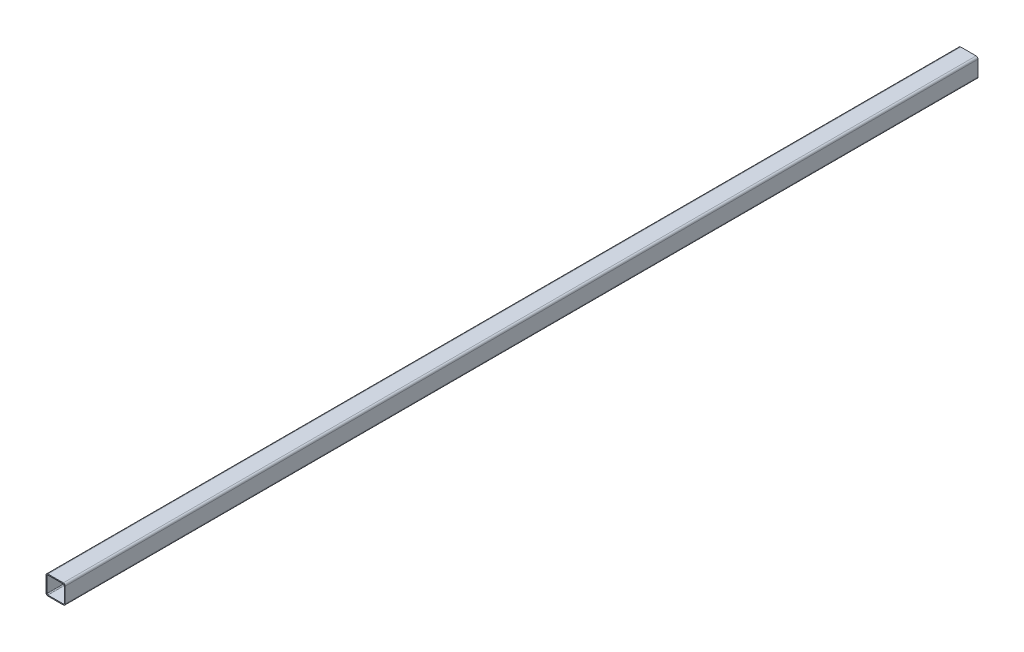
ISO-10303-21;
HEADER;
FILE_DESCRIPTION(('STEP AP214'),'2;1');
FILE_NAME('part.step','',(''),(''),'','','');
FILE_SCHEMA(('AUTOMOTIVE_DESIGN { 1 0 10303 214 1 1 1 1 }'));
ENDSEC;
DATA;
#1=APPLICATION_CONTEXT('core data for automotive mechanical design processes');
#2=APPLICATION_PROTOCOL_DEFINITION('international standard','automotive_design',2000,#1);
#3=PRODUCT_CONTEXT('',#1,'mechanical');
#4=PRODUCT('Part','Part','',(#3));
#5=PRODUCT_RELATED_PRODUCT_CATEGORY('part','',(#4));
#6=PRODUCT_DEFINITION_FORMATION('','',#4);
#7=PRODUCT_DEFINITION_CONTEXT('part definition',#1,'design');
#8=PRODUCT_DEFINITION('design','',#6,#7);
#9=PRODUCT_DEFINITION_SHAPE('','',#8);
#10=(LENGTH_UNIT() NAMED_UNIT(*) SI_UNIT(.MILLI.,.METRE.));
#11=(NAMED_UNIT(*) PLANE_ANGLE_UNIT() SI_UNIT($,.RADIAN.));
#12=(NAMED_UNIT(*) SI_UNIT($,.STERADIAN.) SOLID_ANGLE_UNIT());
#13=UNCERTAINTY_MEASURE_WITH_UNIT(LENGTH_MEASURE(1.E-05),#10,'distance_accuracy_value','');
#14=(GEOMETRIC_REPRESENTATION_CONTEXT(3) GLOBAL_UNCERTAINTY_ASSIGNED_CONTEXT((#13)) GLOBAL_UNIT_ASSIGNED_CONTEXT((#10,
#11,#12)) REPRESENTATION_CONTEXT('',''));
#15=CARTESIAN_POINT('',(0.,0.,0.));
#16=DIRECTION('',(0.,0.,1.));
#17=DIRECTION('',(1.,0.,0.));
#18=AXIS2_PLACEMENT_3D('',#15,#16,#17);
#19=CARTESIAN_POINT('',(16.,-16.,1900.));
#20=DIRECTION('',(0.,0.,-1.));
#21=DIRECTION('',(-1.,0.,0.));
#22=AXIS2_PLACEMENT_3D('',#19,#20,#21);
#23=PLANE('',#22);
#24=CARTESIAN_POINT('',(16.,-16.,1900.));
#25=DIRECTION('',(0.,0.,1.));
#26=DIRECTION('',(-1.,0.,0.));
#27=AXIS2_PLACEMENT_3D('',#24,#25,#26);
#28=CIRCLE('',#27,4.);
#29=CARTESIAN_POINT('',(16.,-20.,1900.));
#30=VERTEX_POINT('',#29);
#31=CARTESIAN_POINT('',(20.,-16.,1900.));
#32=VERTEX_POINT('',#31);
#33=EDGE_CURVE('E212',#30,#32,#28,.T.);
#34=ORIENTED_EDGE('',*,*,#33,.T.);
#35=DIRECTION('',(0.,1.,0.));
#36=VECTOR('',#35,1.);
#37=CARTESIAN_POINT('',(20.,16.,1900.));
#38=LINE('',#37,#36);
#39=CARTESIAN_POINT('',(20.,16.,1900.));
#40=VERTEX_POINT('',#39);
#41=EDGE_CURVE('E215',#32,#40,#38,.T.);
#42=ORIENTED_EDGE('',*,*,#41,.T.);
#43=CARTESIAN_POINT('',(16.,16.,1900.));
#44=DIRECTION('',(0.,0.,1.));
#45=DIRECTION('',(-1.,0.,0.));
#46=AXIS2_PLACEMENT_3D('',#43,#44,#45);
#47=CIRCLE('',#46,4.);
#48=CARTESIAN_POINT('',(16.,20.,1900.));
#49=VERTEX_POINT('',#48);
#50=EDGE_CURVE('E218',#40,#49,#47,.T.);
#51=ORIENTED_EDGE('',*,*,#50,.T.);
#52=DIRECTION('',(-1.,0.,0.));
#53=VECTOR('',#52,1.);
#54=CARTESIAN_POINT('',(-16.,20.,1900.));
#55=LINE('',#54,#53);
#56=CARTESIAN_POINT('',(-16.,20.,1900.));
#57=VERTEX_POINT('',#56);
#58=EDGE_CURVE('E220',#49,#57,#55,.T.);
#59=ORIENTED_EDGE('',*,*,#58,.T.);
#60=CARTESIAN_POINT('',(-16.,16.,1900.));
#61=DIRECTION('',(0.,0.,1.));
#62=DIRECTION('',(1.,0.,0.));
#63=AXIS2_PLACEMENT_3D('',#60,#61,#62);
#64=CIRCLE('',#63,4.);
#65=CARTESIAN_POINT('',(-20.,16.,1900.));
#66=VERTEX_POINT('',#65);
#67=EDGE_CURVE('E222',#57,#66,#64,.T.);
#68=ORIENTED_EDGE('',*,*,#67,.T.);
#69=DIRECTION('',(0.,-1.,0.));
#70=VECTOR('',#69,1.);
#71=CARTESIAN_POINT('',(-20.,16.,1900.));
#72=LINE('',#71,#70);
#73=CARTESIAN_POINT('',(-20.,-16.,1900.));
#74=VERTEX_POINT('',#73);
#75=EDGE_CURVE('E224',#66,#74,#72,.T.);
#76=ORIENTED_EDGE('',*,*,#75,.T.);
#77=CARTESIAN_POINT('',(-16.,-16.,1900.));
#78=DIRECTION('',(0.,0.,1.));
#79=DIRECTION('',(1.,0.,0.));
#80=AXIS2_PLACEMENT_3D('',#77,#78,#79);
#81=CIRCLE('',#80,4.);
#82=CARTESIAN_POINT('',(-16.,-20.,1900.));
#83=VERTEX_POINT('',#82);
#84=EDGE_CURVE('E226',#74,#83,#81,.T.);
#85=ORIENTED_EDGE('',*,*,#84,.T.);
#86=DIRECTION('',(1.,0.,0.));
#87=VECTOR('',#86,1.);
#88=CARTESIAN_POINT('',(-16.,-20.,1900.));
#89=LINE('',#88,#87);
#90=EDGE_CURVE('E228',#83,#30,#89,.T.);
#91=ORIENTED_EDGE('',*,*,#90,.T.);
#92=EDGE_LOOP('',(#34,#42,#51,#59,#68,#76,#85,#91));
#93=FACE_BOUND('',#92,.T.);
#94=CARTESIAN_POINT('',(-16.,16.,1900.));
#95=DIRECTION('',(0.,0.,1.));
#96=DIRECTION('',(1.,0.,0.));
#97=AXIS2_PLACEMENT_3D('',#94,#95,#96);
#98=CIRCLE('',#97,2.);
#99=CARTESIAN_POINT('',(-16.,18.,1900.));
#100=VERTEX_POINT('',#99);
#101=CARTESIAN_POINT('',(-18.,16.,1900.));
#102=VERTEX_POINT('',#101);
#103=EDGE_CURVE('E147',#100,#102,#98,.T.);
#104=ORIENTED_EDGE('',*,*,#103,.F.);
#105=DIRECTION('',(-1.,0.,0.));
#106=VECTOR('',#105,1.);
#107=CARTESIAN_POINT('',(-16.,18.,1900.));
#108=LINE('',#107,#106);
#109=CARTESIAN_POINT('',(16.,18.,1900.));
#110=VERTEX_POINT('',#109);
#111=EDGE_CURVE('E180',#110,#100,#108,.T.);
#112=ORIENTED_EDGE('',*,*,#111,.F.);
#113=CARTESIAN_POINT('',(16.,16.,1900.));
#114=DIRECTION('',(0.,0.,1.));
#115=DIRECTION('',(-1.,0.,0.));
#116=AXIS2_PLACEMENT_3D('',#113,#114,#115);
#117=CIRCLE('',#116,2.);
#118=CARTESIAN_POINT('',(18.,16.,1900.));
#119=VERTEX_POINT('',#118);
#120=EDGE_CURVE('E178',#119,#110,#117,.T.);
#121=ORIENTED_EDGE('',*,*,#120,.F.);
#122=DIRECTION('',(0.,1.,0.));
#123=VECTOR('',#122,1.);
#124=CARTESIAN_POINT('',(18.,16.,1900.));
#125=LINE('',#124,#123);
#126=CARTESIAN_POINT('',(18.,-16.,1900.));
#127=VERTEX_POINT('',#126);
#128=EDGE_CURVE('E176',#127,#119,#125,.T.);
#129=ORIENTED_EDGE('',*,*,#128,.F.);
#130=CARTESIAN_POINT('',(16.,-16.,1900.));
#131=DIRECTION('',(0.,0.,1.));
#132=DIRECTION('',(-1.,0.,0.));
#133=AXIS2_PLACEMENT_3D('',#130,#131,#132);
#134=CIRCLE('',#133,2.);
#135=CARTESIAN_POINT('',(16.,-18.,1900.));
#136=VERTEX_POINT('',#135);
#137=EDGE_CURVE('E174',#136,#127,#134,.T.);
#138=ORIENTED_EDGE('',*,*,#137,.F.);
#139=DIRECTION('',(1.,0.,0.));
#140=VECTOR('',#139,1.);
#141=CARTESIAN_POINT('',(-16.,-18.,1900.));
#142=LINE('',#141,#140);
#143=CARTESIAN_POINT('',(-16.,-18.,1900.));
#144=VERTEX_POINT('',#143);
#145=EDGE_CURVE('E170',#144,#136,#142,.T.);
#146=ORIENTED_EDGE('',*,*,#145,.F.);
#147=CARTESIAN_POINT('',(-16.,-16.,1900.));
#148=DIRECTION('',(0.,0.,1.));
#149=DIRECTION('',(1.,0.,0.));
#150=AXIS2_PLACEMENT_3D('',#147,#148,#149);
#151=CIRCLE('',#150,2.);
#152=CARTESIAN_POINT('',(-18.,-16.,1900.));
#153=VERTEX_POINT('',#152);
#154=EDGE_CURVE('E168',#153,#144,#151,.T.);
#155=ORIENTED_EDGE('',*,*,#154,.F.);
#156=DIRECTION('',(0.,-1.,0.));
#157=VECTOR('',#156,1.);
#158=CARTESIAN_POINT('',(-18.,16.,1900.));
#159=LINE('',#158,#157);
#160=EDGE_CURVE('E155',#102,#153,#159,.T.);
#161=ORIENTED_EDGE('',*,*,#160,.F.);
#162=EDGE_LOOP('',(#104,#112,#121,#129,#138,#146,#155,#161));
#163=FACE_BOUND('',#162,.T.);
#164=ADVANCED_FACE('F34',(#93,#163),#23,.F.);
#165=CARTESIAN_POINT('',(16.,-16.,0.));
#166=DIRECTION('',(0.,0.,-1.));
#167=DIRECTION('',(-1.,0.,0.));
#168=AXIS2_PLACEMENT_3D('',#165,#166,#167);
#169=PLANE('',#168);
#170=CARTESIAN_POINT('',(16.,-16.,0.));
#171=DIRECTION('',(0.,0.,1.));
#172=DIRECTION('',(-1.,0.,0.));
#173=AXIS2_PLACEMENT_3D('',#170,#171,#172);
#174=CIRCLE('',#173,4.);
#175=CARTESIAN_POINT('',(16.,-20.,0.));
#176=VERTEX_POINT('',#175);
#177=CARTESIAN_POINT('',(20.,-16.,0.));
#178=VERTEX_POINT('',#177);
#179=EDGE_CURVE('E163',#176,#178,#174,.T.);
#180=ORIENTED_EDGE('',*,*,#179,.F.);
#181=DIRECTION('',(1.,0.,0.));
#182=VECTOR('',#181,1.);
#183=CARTESIAN_POINT('',(-16.,-20.,0.));
#184=LINE('',#183,#182);
#185=CARTESIAN_POINT('',(-16.,-20.,0.));
#186=VERTEX_POINT('',#185);
#187=EDGE_CURVE('E216',#186,#176,#184,.T.);
#188=ORIENTED_EDGE('',*,*,#187,.F.);
#189=CARTESIAN_POINT('',(-16.,-16.,0.));
#190=DIRECTION('',(0.,0.,1.));
#191=DIRECTION('',(1.,0.,0.));
#192=AXIS2_PLACEMENT_3D('',#189,#190,#191);
#193=CIRCLE('',#192,4.);
#194=CARTESIAN_POINT('',(-20.,-16.,0.));
#195=VERTEX_POINT('',#194);
#196=EDGE_CURVE('E243',#195,#186,#193,.T.);
#197=ORIENTED_EDGE('',*,*,#196,.F.);
#198=DIRECTION('',(0.,-1.,0.));
#199=VECTOR('',#198,1.);
#200=CARTESIAN_POINT('',(-20.,16.,0.));
#201=LINE('',#200,#199);
#202=CARTESIAN_POINT('',(-20.,16.,0.));
#203=VERTEX_POINT('',#202);
#204=EDGE_CURVE('E241',#203,#195,#201,.T.);
#205=ORIENTED_EDGE('',*,*,#204,.F.);
#206=CARTESIAN_POINT('',(-16.,16.,0.));
#207=DIRECTION('',(0.,0.,1.));
#208=DIRECTION('',(1.,0.,0.));
#209=AXIS2_PLACEMENT_3D('',#206,#207,#208);
#210=CIRCLE('',#209,4.);
#211=CARTESIAN_POINT('',(-16.,20.,0.));
#212=VERTEX_POINT('',#211);
#213=EDGE_CURVE('E239',#212,#203,#210,.T.);
#214=ORIENTED_EDGE('',*,*,#213,.F.);
#215=DIRECTION('',(-1.,0.,0.));
#216=VECTOR('',#215,1.);
#217=CARTESIAN_POINT('',(-16.,20.,0.));
#218=LINE('',#217,#216);
#219=CARTESIAN_POINT('',(16.,20.,0.));
#220=VERTEX_POINT('',#219);
#221=EDGE_CURVE('E237',#220,#212,#218,.T.);
#222=ORIENTED_EDGE('',*,*,#221,.F.);
#223=CARTESIAN_POINT('',(16.,16.,0.));
#224=DIRECTION('',(0.,0.,1.));
#225=DIRECTION('',(-1.,0.,0.));
#226=AXIS2_PLACEMENT_3D('',#223,#224,#225);
#227=CIRCLE('',#226,4.);
#228=CARTESIAN_POINT('',(20.,16.,0.));
#229=VERTEX_POINT('',#228);
#230=EDGE_CURVE('E235',#229,#220,#227,.T.);
#231=ORIENTED_EDGE('',*,*,#230,.F.);
#232=DIRECTION('',(0.,1.,0.));
#233=VECTOR('',#232,1.);
#234=CARTESIAN_POINT('',(20.,16.,0.));
#235=LINE('',#234,#233);
#236=EDGE_CURVE('E233',#178,#229,#235,.T.);
#237=ORIENTED_EDGE('',*,*,#236,.F.);
#238=EDGE_LOOP('',(#180,#188,#197,#205,#214,#222,#231,#237));
#239=FACE_BOUND('',#238,.T.);
#240=DIRECTION('',(-1.,0.,0.));
#241=VECTOR('',#240,1.);
#242=CARTESIAN_POINT('',(-16.,18.,0.));
#243=LINE('',#242,#241);
#244=CARTESIAN_POINT('',(16.,18.,0.));
#245=VERTEX_POINT('',#244);
#246=CARTESIAN_POINT('',(-16.,18.,0.));
#247=VERTEX_POINT('',#246);
#248=EDGE_CURVE('E156',#245,#247,#243,.T.);
#249=ORIENTED_EDGE('',*,*,#248,.T.);
#250=CARTESIAN_POINT('',(-16.,16.,0.));
#251=DIRECTION('',(0.,0.,1.));
#252=DIRECTION('',(1.,0.,0.));
#253=AXIS2_PLACEMENT_3D('',#250,#251,#252);
#254=CIRCLE('',#253,2.);
#255=CARTESIAN_POINT('',(-18.,16.,0.));
#256=VERTEX_POINT('',#255);
#257=EDGE_CURVE('E57',#247,#256,#254,.T.);
#258=ORIENTED_EDGE('',*,*,#257,.T.);
#259=DIRECTION('',(0.,-1.,0.));
#260=VECTOR('',#259,1.);
#261=CARTESIAN_POINT('',(-18.,16.,0.));
#262=LINE('',#261,#260);
#263=CARTESIAN_POINT('',(-18.,-16.,0.));
#264=VERTEX_POINT('',#263);
#265=EDGE_CURVE('E162',#256,#264,#262,.T.);
#266=ORIENTED_EDGE('',*,*,#265,.T.);
#267=CARTESIAN_POINT('',(-16.,-16.,0.));
#268=DIRECTION('',(0.,0.,1.));
#269=DIRECTION('',(1.,0.,0.));
#270=AXIS2_PLACEMENT_3D('',#267,#268,#269);
#271=CIRCLE('',#270,2.);
#272=CARTESIAN_POINT('',(-16.,-18.,0.));
#273=VERTEX_POINT('',#272);
#274=EDGE_CURVE('E184',#264,#273,#271,.T.);
#275=ORIENTED_EDGE('',*,*,#274,.T.);
#276=DIRECTION('',(1.,0.,0.));
#277=VECTOR('',#276,1.);
#278=CARTESIAN_POINT('',(-16.,-18.,0.));
#279=LINE('',#278,#277);
#280=CARTESIAN_POINT('',(16.,-18.,0.));
#281=VERTEX_POINT('',#280);
#282=EDGE_CURVE('E187',#273,#281,#279,.T.);
#283=ORIENTED_EDGE('',*,*,#282,.T.);
#284=CARTESIAN_POINT('',(16.,-16.,0.));
#285=DIRECTION('',(0.,0.,1.));
#286=DIRECTION('',(-1.,0.,0.));
#287=AXIS2_PLACEMENT_3D('',#284,#285,#286);
#288=CIRCLE('',#287,2.);
#289=CARTESIAN_POINT('',(18.,-16.,0.));
#290=VERTEX_POINT('',#289);
#291=EDGE_CURVE('E190',#281,#290,#288,.T.);
#292=ORIENTED_EDGE('',*,*,#291,.T.);
#293=DIRECTION('',(0.,1.,0.));
#294=VECTOR('',#293,1.);
#295=CARTESIAN_POINT('',(18.,16.,0.));
#296=LINE('',#295,#294);
#297=CARTESIAN_POINT('',(18.,16.,0.));
#298=VERTEX_POINT('',#297);
#299=EDGE_CURVE('E193',#290,#298,#296,.T.);
#300=ORIENTED_EDGE('',*,*,#299,.T.);
#301=CARTESIAN_POINT('',(16.,16.,0.));
#302=DIRECTION('',(0.,0.,1.));
#303=DIRECTION('',(-1.,0.,0.));
#304=AXIS2_PLACEMENT_3D('',#301,#302,#303);
#305=CIRCLE('',#304,2.);
#306=EDGE_CURVE('E196',#298,#245,#305,.T.);
#307=ORIENTED_EDGE('',*,*,#306,.T.);
#308=EDGE_LOOP('',(#249,#258,#266,#275,#283,#292,#300,#307));
#309=FACE_BOUND('',#308,.T.);
#310=ADVANCED_FACE('F273',(#239,#309),#169,.T.);
#311=CARTESIAN_POINT('',(16.,-16.,1900.));
#312=DIRECTION('',(0.,0.,-1.));
#313=DIRECTION('',(-1.,0.,0.));
#314=AXIS2_PLACEMENT_3D('',#311,#312,#313);
#315=CYLINDRICAL_SURFACE('',#314,4.);
#316=ORIENTED_EDGE('',*,*,#179,.T.);
#317=DIRECTION('',(0.,0.,-1.));
#318=VECTOR('',#317,1.);
#319=CARTESIAN_POINT('',(20.,-16.,1900.));
#320=LINE('',#319,#318);
#321=EDGE_CURVE('E11',#32,#178,#320,.T.);
#322=ORIENTED_EDGE('',*,*,#321,.F.);
#323=ORIENTED_EDGE('',*,*,#33,.F.);
#324=DIRECTION('',(0.,0.,-1.));
#325=VECTOR('',#324,1.);
#326=CARTESIAN_POINT('',(16.,-20.,1900.));
#327=LINE('',#326,#325);
#328=EDGE_CURVE('E230',#30,#176,#327,.T.);
#329=ORIENTED_EDGE('',*,*,#328,.T.);
#330=EDGE_LOOP('',(#316,#322,#323,#329));
#331=FACE_BOUND('',#330,.T.);
#332=ADVANCED_FACE('F36',(#331),#315,.T.);
#333=CARTESIAN_POINT('',(20.,16.,1900.));
#334=DIRECTION('',(-1.,0.,0.));
#335=DIRECTION('',(0.,-1.,0.));
#336=AXIS2_PLACEMENT_3D('',#333,#334,#335);
#337=PLANE('',#336);
#338=ORIENTED_EDGE('',*,*,#236,.T.);
#339=DIRECTION('',(0.,0.,-1.));
#340=VECTOR('',#339,1.);
#341=CARTESIAN_POINT('',(20.,16.,1900.));
#342=LINE('',#341,#340);
#343=EDGE_CURVE('E42',#40,#229,#342,.T.);
#344=ORIENTED_EDGE('',*,*,#343,.F.);
#345=ORIENTED_EDGE('',*,*,#41,.F.);
#346=ORIENTED_EDGE('',*,*,#321,.T.);
#347=EDGE_LOOP('',(#338,#344,#345,#346));
#348=FACE_BOUND('',#347,.T.);
#349=ADVANCED_FACE('F290',(#348),#337,.F.);
#350=CARTESIAN_POINT('',(16.,16.,1900.));
#351=DIRECTION('',(0.,0.,-1.));
#352=DIRECTION('',(-1.,0.,0.));
#353=AXIS2_PLACEMENT_3D('',#350,#351,#352);
#354=CYLINDRICAL_SURFACE('',#353,4.);
#355=ORIENTED_EDGE('',*,*,#230,.T.);
#356=DIRECTION('',(0.,0.,-1.));
#357=VECTOR('',#356,1.);
#358=CARTESIAN_POINT('',(16.,20.,1900.));
#359=LINE('',#358,#357);
#360=EDGE_CURVE('E260',#49,#220,#359,.T.);
#361=ORIENTED_EDGE('',*,*,#360,.F.);
#362=ORIENTED_EDGE('',*,*,#50,.F.);
#363=ORIENTED_EDGE('',*,*,#343,.T.);
#364=EDGE_LOOP('',(#355,#361,#362,#363));
#365=FACE_BOUND('',#364,.T.);
#366=ADVANCED_FACE('F267',(#365),#354,.T.);
#367=CARTESIAN_POINT('',(-16.,20.,1900.));
#368=DIRECTION('',(0.,-1.,0.));
#369=DIRECTION('',(0.,0.,-1.));
#370=AXIS2_PLACEMENT_3D('',#367,#368,#369);
#371=PLANE('',#370);
#372=ORIENTED_EDGE('',*,*,#221,.T.);
#373=DIRECTION('',(0.,0.,-1.));
#374=VECTOR('',#373,1.);
#375=CARTESIAN_POINT('',(-16.,20.,1900.));
#376=LINE('',#375,#374);
#377=EDGE_CURVE('E257',#57,#212,#376,.T.);
#378=ORIENTED_EDGE('',*,*,#377,.F.);
#379=ORIENTED_EDGE('',*,*,#58,.F.);
#380=ORIENTED_EDGE('',*,*,#360,.T.);
#381=EDGE_LOOP('',(#372,#378,#379,#380));
#382=FACE_BOUND('',#381,.T.);
#383=ADVANCED_FACE('F279',(#382),#371,.F.);
#384=CARTESIAN_POINT('',(-16.,16.,1900.));
#385=DIRECTION('',(0.,0.,-1.));
#386=DIRECTION('',(-1.,0.,0.));
#387=AXIS2_PLACEMENT_3D('',#384,#385,#386);
#388=CYLINDRICAL_SURFACE('',#387,4.);
#389=ORIENTED_EDGE('',*,*,#213,.T.);
#390=DIRECTION('',(0.,0.,-1.));
#391=VECTOR('',#390,1.);
#392=CARTESIAN_POINT('',(-20.,16.,1900.));
#393=LINE('',#392,#391);
#394=EDGE_CURVE('E254',#66,#203,#393,.T.);
#395=ORIENTED_EDGE('',*,*,#394,.F.);
#396=ORIENTED_EDGE('',*,*,#67,.F.);
#397=ORIENTED_EDGE('',*,*,#377,.T.);
#398=EDGE_LOOP('',(#389,#395,#396,#397));
#399=FACE_BOUND('',#398,.T.);
#400=ADVANCED_FACE('F283',(#399),#388,.T.);
#401=CARTESIAN_POINT('',(-20.,16.,1900.));
#402=DIRECTION('',(1.,0.,0.));
#403=DIRECTION('',(0.,1.,0.));
#404=AXIS2_PLACEMENT_3D('',#401,#402,#403);
#405=PLANE('',#404);
#406=ORIENTED_EDGE('',*,*,#204,.T.);
#407=DIRECTION('',(0.,0.,-1.));
#408=VECTOR('',#407,1.);
#409=CARTESIAN_POINT('',(-20.,-16.,1900.));
#410=LINE('',#409,#408);
#411=EDGE_CURVE('E251',#74,#195,#410,.T.);
#412=ORIENTED_EDGE('',*,*,#411,.F.);
#413=ORIENTED_EDGE('',*,*,#75,.F.);
#414=ORIENTED_EDGE('',*,*,#394,.T.);
#415=EDGE_LOOP('',(#406,#412,#413,#414));
#416=FACE_BOUND('',#415,.T.);
#417=ADVANCED_FACE('F303',(#416),#405,.F.);
#418=CARTESIAN_POINT('',(-16.,-16.,1900.));
#419=DIRECTION('',(0.,0.,-1.));
#420=DIRECTION('',(-1.,0.,0.));
#421=AXIS2_PLACEMENT_3D('',#418,#419,#420);
#422=CYLINDRICAL_SURFACE('',#421,4.);
#423=ORIENTED_EDGE('',*,*,#196,.T.);
#424=DIRECTION('',(0.,0.,-1.));
#425=VECTOR('',#424,1.);
#426=CARTESIAN_POINT('',(-16.,-20.,1900.));
#427=LINE('',#426,#425);
#428=EDGE_CURVE('E248',#83,#186,#427,.T.);
#429=ORIENTED_EDGE('',*,*,#428,.F.);
#430=ORIENTED_EDGE('',*,*,#84,.F.);
#431=ORIENTED_EDGE('',*,*,#411,.T.);
#432=EDGE_LOOP('',(#423,#429,#430,#431));
#433=FACE_BOUND('',#432,.T.);
#434=ADVANCED_FACE('F301',(#433),#422,.T.);
#435=CARTESIAN_POINT('',(-16.,-20.,1900.));
#436=DIRECTION('',(0.,1.,0.));
#437=DIRECTION('',(0.,0.,1.));
#438=AXIS2_PLACEMENT_3D('',#435,#436,#437);
#439=PLANE('',#438);
#440=ORIENTED_EDGE('',*,*,#187,.T.);
#441=ORIENTED_EDGE('',*,*,#328,.F.);
#442=ORIENTED_EDGE('',*,*,#90,.F.);
#443=ORIENTED_EDGE('',*,*,#428,.T.);
#444=EDGE_LOOP('',(#440,#441,#442,#443));
#445=FACE_BOUND('',#444,.T.);
#446=ADVANCED_FACE('F296',(#445),#439,.F.);
#447=CARTESIAN_POINT('',(-16.,16.,1900.));
#448=DIRECTION('',(0.,0.,-1.));
#449=DIRECTION('',(-1.,0.,0.));
#450=AXIS2_PLACEMENT_3D('',#447,#448,#449);
#451=CYLINDRICAL_SURFACE('',#450,2.);
#452=ORIENTED_EDGE('',*,*,#257,.F.);
#453=DIRECTION('',(0.,0.,-1.));
#454=VECTOR('',#453,1.);
#455=CARTESIAN_POINT('',(-16.,18.,1900.));
#456=LINE('',#455,#454);
#457=EDGE_CURVE('E151',#100,#247,#456,.T.);
#458=ORIENTED_EDGE('',*,*,#457,.F.);
#459=ORIENTED_EDGE('',*,*,#103,.T.);
#460=DIRECTION('',(0.,0.,-1.));
#461=VECTOR('',#460,1.);
#462=CARTESIAN_POINT('',(-18.,16.,1900.));
#463=LINE('',#462,#461);
#464=EDGE_CURVE('E150',#102,#256,#463,.T.);
#465=ORIENTED_EDGE('',*,*,#464,.T.);
#466=EDGE_LOOP('',(#452,#458,#459,#465));
#467=FACE_BOUND('',#466,.T.);
#468=ADVANCED_FACE('F149',(#467),#451,.F.);
#469=CARTESIAN_POINT('',(-18.,16.,1900.));
#470=DIRECTION('',(1.,0.,0.));
#471=DIRECTION('',(0.,1.,0.));
#472=AXIS2_PLACEMENT_3D('',#469,#470,#471);
#473=PLANE('',#472);
#474=ORIENTED_EDGE('',*,*,#265,.F.);
#475=ORIENTED_EDGE('',*,*,#464,.F.);
#476=ORIENTED_EDGE('',*,*,#160,.T.);
#477=DIRECTION('',(0.,0.,-1.));
#478=VECTOR('',#477,1.);
#479=CARTESIAN_POINT('',(-18.,-16.,1900.));
#480=LINE('',#479,#478);
#481=EDGE_CURVE('E164',#153,#264,#480,.T.);
#482=ORIENTED_EDGE('',*,*,#481,.T.);
#483=EDGE_LOOP('',(#474,#475,#476,#482));
#484=FACE_BOUND('',#483,.T.);
#485=ADVANCED_FACE('F159',(#484),#473,.T.);
#486=CARTESIAN_POINT('',(-16.,-16.,1900.));
#487=DIRECTION('',(0.,0.,-1.));
#488=DIRECTION('',(-1.,0.,0.));
#489=AXIS2_PLACEMENT_3D('',#486,#487,#488);
#490=CYLINDRICAL_SURFACE('',#489,2.);
#491=ORIENTED_EDGE('',*,*,#274,.F.);
#492=ORIENTED_EDGE('',*,*,#481,.F.);
#493=ORIENTED_EDGE('',*,*,#154,.T.);
#494=DIRECTION('',(0.,0.,-1.));
#495=VECTOR('',#494,1.);
#496=CARTESIAN_POINT('',(-16.,-18.,1900.));
#497=LINE('',#496,#495);
#498=EDGE_CURVE('E209',#144,#273,#497,.T.);
#499=ORIENTED_EDGE('',*,*,#498,.T.);
#500=EDGE_LOOP('',(#491,#492,#493,#499));
#501=FACE_BOUND('',#500,.T.);
#502=ADVANCED_FACE('F328',(#501),#490,.F.);
#503=CARTESIAN_POINT('',(-16.,-18.,1900.));
#504=DIRECTION('',(0.,1.,0.));
#505=DIRECTION('',(0.,0.,1.));
#506=AXIS2_PLACEMENT_3D('',#503,#504,#505);
#507=PLANE('',#506);
#508=ORIENTED_EDGE('',*,*,#282,.F.);
#509=ORIENTED_EDGE('',*,*,#498,.F.);
#510=ORIENTED_EDGE('',*,*,#145,.T.);
#511=DIRECTION('',(0.,0.,-1.));
#512=VECTOR('',#511,1.);
#513=CARTESIAN_POINT('',(16.,-18.,1900.));
#514=LINE('',#513,#512);
#515=EDGE_CURVE('E207',#136,#281,#514,.T.);
#516=ORIENTED_EDGE('',*,*,#515,.T.);
#517=EDGE_LOOP('',(#508,#509,#510,#516));
#518=FACE_BOUND('',#517,.T.);
#519=ADVANCED_FACE('F332',(#518),#507,.T.);
#520=CARTESIAN_POINT('',(16.,-16.,1900.));
#521=DIRECTION('',(0.,0.,-1.));
#522=DIRECTION('',(-1.,0.,0.));
#523=AXIS2_PLACEMENT_3D('',#520,#521,#522);
#524=CYLINDRICAL_SURFACE('',#523,2.);
#525=ORIENTED_EDGE('',*,*,#291,.F.);
#526=ORIENTED_EDGE('',*,*,#515,.F.);
#527=ORIENTED_EDGE('',*,*,#137,.T.);
#528=DIRECTION('',(0.,0.,-1.));
#529=VECTOR('',#528,1.);
#530=CARTESIAN_POINT('',(18.,-16.,1900.));
#531=LINE('',#530,#529);
#532=EDGE_CURVE('E205',#127,#290,#531,.T.);
#533=ORIENTED_EDGE('',*,*,#532,.T.);
#534=EDGE_LOOP('',(#525,#526,#527,#533));
#535=FACE_BOUND('',#534,.T.);
#536=ADVANCED_FACE('F338',(#535),#524,.F.);
#537=CARTESIAN_POINT('',(18.,16.,1900.));
#538=DIRECTION('',(-1.,0.,0.));
#539=DIRECTION('',(0.,0.,1.));
#540=AXIS2_PLACEMENT_3D('',#537,#538,#539);
#541=PLANE('',#540);
#542=ORIENTED_EDGE('',*,*,#299,.F.);
#543=ORIENTED_EDGE('',*,*,#532,.F.);
#544=ORIENTED_EDGE('',*,*,#128,.T.);
#545=DIRECTION('',(0.,0.,-1.));
#546=VECTOR('',#545,1.);
#547=CARTESIAN_POINT('',(18.,16.,1900.));
#548=LINE('',#547,#546);
#549=EDGE_CURVE('E203',#119,#298,#548,.T.);
#550=ORIENTED_EDGE('',*,*,#549,.T.);
#551=EDGE_LOOP('',(#542,#543,#544,#550));
#552=FACE_BOUND('',#551,.T.);
#553=ADVANCED_FACE('F342',(#552),#541,.T.);
#554=CARTESIAN_POINT('',(16.,16.,1900.));
#555=DIRECTION('',(0.,0.,-1.));
#556=DIRECTION('',(-1.,0.,0.));
#557=AXIS2_PLACEMENT_3D('',#554,#555,#556);
#558=CYLINDRICAL_SURFACE('',#557,2.);
#559=ORIENTED_EDGE('',*,*,#306,.F.);
#560=ORIENTED_EDGE('',*,*,#549,.F.);
#561=ORIENTED_EDGE('',*,*,#120,.T.);
#562=DIRECTION('',(0.,0.,-1.));
#563=VECTOR('',#562,1.);
#564=CARTESIAN_POINT('',(16.,18.,1900.));
#565=LINE('',#564,#563);
#566=EDGE_CURVE('E49',#110,#245,#565,.T.);
#567=ORIENTED_EDGE('',*,*,#566,.T.);
#568=EDGE_LOOP('',(#559,#560,#561,#567));
#569=FACE_BOUND('',#568,.T.);
#570=ADVANCED_FACE('F346',(#569),#558,.F.);
#571=CARTESIAN_POINT('',(-16.,18.,1900.));
#572=DIRECTION('',(0.,-1.,0.));
#573=DIRECTION('',(0.,0.,-1.));
#574=AXIS2_PLACEMENT_3D('',#571,#572,#573);
#575=PLANE('',#574);
#576=ORIENTED_EDGE('',*,*,#248,.F.);
#577=ORIENTED_EDGE('',*,*,#566,.F.);
#578=ORIENTED_EDGE('',*,*,#111,.T.);
#579=ORIENTED_EDGE('',*,*,#457,.T.);
#580=EDGE_LOOP('',(#576,#577,#578,#579));
#581=FACE_BOUND('',#580,.T.);
#582=ADVANCED_FACE('F350',(#581),#575,.T.);
#583=CLOSED_SHELL('',(#164,#310,#332,#349,#366,#383,#400,#417,#434,#446,#468,#485,#502,#519,
#536,#553,#570,#582));
#584=MANIFOLD_SOLID_BREP('B2',#583);
#585=ADVANCED_BREP_SHAPE_REPRESENTATION('',(#18,#584),#14);
#586=SHAPE_DEFINITION_REPRESENTATION(#9,#585);
ENDSEC;
END-ISO-10303-21;
